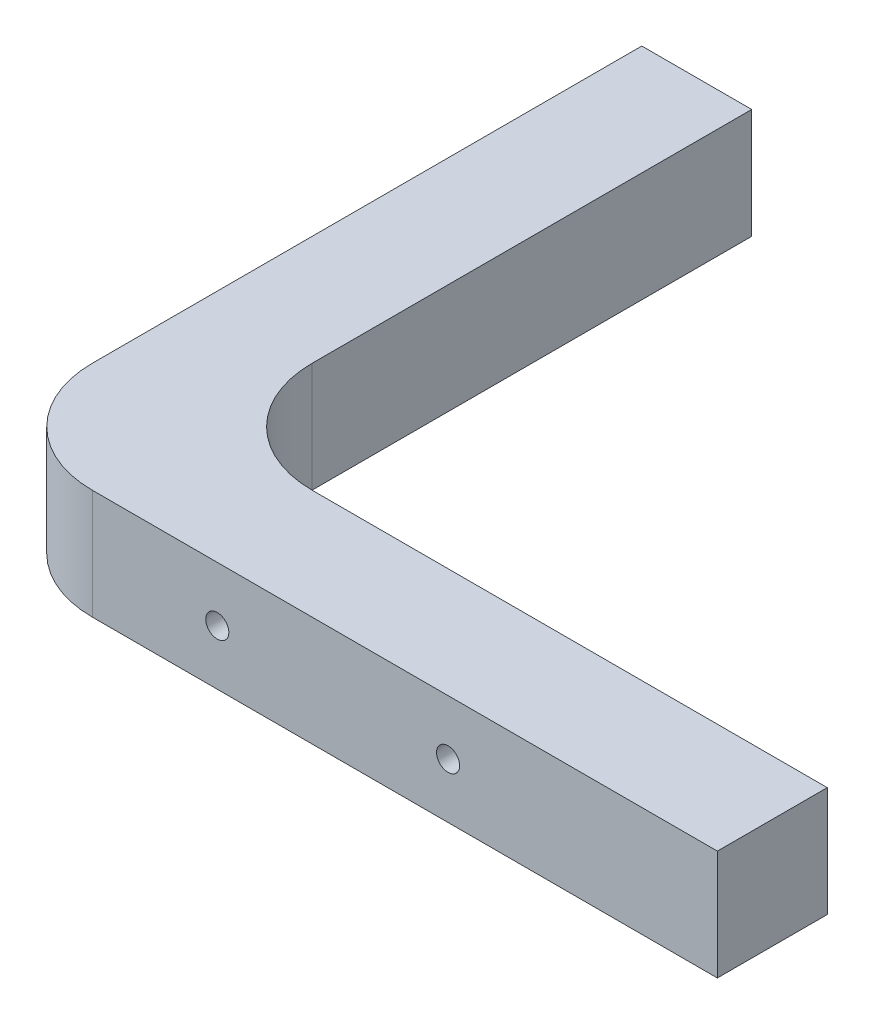
ISO-10303-21;
HEADER;
FILE_DESCRIPTION(('STEP AP214'),'2;1');
FILE_NAME('part.step','',(''),(''),'','','');
FILE_SCHEMA(('AUTOMOTIVE_DESIGN { 1 0 10303 214 1 1 1 1 }'));
ENDSEC;
DATA;
#1=APPLICATION_CONTEXT('core data for automotive mechanical design processes');
#2=APPLICATION_PROTOCOL_DEFINITION('international standard','automotive_design',2000,#1);
#3=PRODUCT_CONTEXT('',#1,'mechanical');
#4=PRODUCT('Part','Part','',(#3));
#5=PRODUCT_RELATED_PRODUCT_CATEGORY('part','',(#4));
#6=PRODUCT_DEFINITION_FORMATION('','',#4);
#7=PRODUCT_DEFINITION_CONTEXT('part definition',#1,'design');
#8=PRODUCT_DEFINITION('design','',#6,#7);
#9=PRODUCT_DEFINITION_SHAPE('','',#8);
#10=(LENGTH_UNIT() NAMED_UNIT(*) SI_UNIT(.MILLI.,.METRE.));
#11=(NAMED_UNIT(*) PLANE_ANGLE_UNIT() SI_UNIT($,.RADIAN.));
#12=(NAMED_UNIT(*) SI_UNIT($,.STERADIAN.) SOLID_ANGLE_UNIT());
#13=UNCERTAINTY_MEASURE_WITH_UNIT(LENGTH_MEASURE(1.E-05),#10,'distance_accuracy_value','');
#14=(GEOMETRIC_REPRESENTATION_CONTEXT(3) GLOBAL_UNCERTAINTY_ASSIGNED_CONTEXT((#13)) GLOBAL_UNIT_ASSIGNED_CONTEXT((#10,
#11,#12)) REPRESENTATION_CONTEXT('',''));
#15=CARTESIAN_POINT('',(0.,0.,0.));
#16=DIRECTION('',(0.,0.,1.));
#17=DIRECTION('',(1.,0.,0.));
#18=AXIS2_PLACEMENT_3D('',#15,#16,#17);
#19=CARTESIAN_POINT('',(0.,20.,-10.));
#20=DIRECTION('',(-1.,0.,0.));
#21=DIRECTION('',(0.,0.,1.));
#22=AXIS2_PLACEMENT_3D('',#19,#20,#21);
#23=PLANE('',#22);
#24=DIRECTION('',(0.,0.,-1.));
#25=VECTOR('',#24,1.);
#26=CARTESIAN_POINT('',(0.,0.,-10.));
#27=LINE('',#26,#25);
#28=CARTESIAN_POINT('',(0.,0.,10.));
#29=VERTEX_POINT('',#28);
#30=CARTESIAN_POINT('',(0.,0.,-10.));
#31=VERTEX_POINT('',#30);
#32=EDGE_CURVE('E127',#29,#31,#27,.T.);
#33=ORIENTED_EDGE('',*,*,#32,.T.);
#34=DIRECTION('',(0.,-1.,0.));
#35=VECTOR('',#34,1.);
#36=CARTESIAN_POINT('',(0.,20.,-10.));
#37=LINE('',#36,#35);
#38=CARTESIAN_POINT('',(0.,20.,-10.));
#39=VERTEX_POINT('',#38);
#40=EDGE_CURVE('E111',#39,#31,#37,.T.);
#41=ORIENTED_EDGE('',*,*,#40,.F.);
#42=DIRECTION('',(0.,0.,-1.));
#43=VECTOR('',#42,1.);
#44=CARTESIAN_POINT('',(0.,20.,-10.));
#45=LINE('',#44,#43);
#46=CARTESIAN_POINT('',(0.,20.,10.));
#47=VERTEX_POINT('',#46);
#48=EDGE_CURVE('E114',#47,#39,#45,.T.);
#49=ORIENTED_EDGE('',*,*,#48,.F.);
#50=DIRECTION('',(0.,-1.,0.));
#51=VECTOR('',#50,1.);
#52=CARTESIAN_POINT('',(0.,20.,10.));
#53=LINE('',#52,#51);
#54=EDGE_CURVE('E168',#47,#29,#53,.T.);
#55=ORIENTED_EDGE('',*,*,#54,.T.);
#56=EDGE_LOOP('',(#33,#41,#49,#55));
#57=FACE_BOUND('',#56,.T.);
#58=ADVANCED_FACE('F45',(#57),#23,.F.);
#59=CARTESIAN_POINT('',(-113.75,20.,-9.99999999999997));
#60=DIRECTION('',(0.,0.,1.));
#61=DIRECTION('',(1.,0.,0.));
#62=AXIS2_PLACEMENT_3D('',#59,#60,#61);
#63=PLANE('',#62);
#64=CARTESIAN_POINT('',(-49.,10.,-9.99999999999999));
#65=DIRECTION('',(0.,0.,-1.));
#66=DIRECTION('',(-1.,0.,0.));
#67=AXIS2_PLACEMENT_3D('',#64,#65,#66);
#68=CIRCLE('',#67,2.1);
#69=CARTESIAN_POINT('',(-51.1,10.,-9.99999999999999));
#70=VERTEX_POINT('',#69);
#71=EDGE_CURVE('E235',#70,#70,#68,.T.);
#72=ORIENTED_EDGE('',*,*,#71,.F.);
#73=EDGE_LOOP('',(#72));
#74=FACE_BOUND('',#73,.T.);
#75=CARTESIAN_POINT('',(-91.,10.,-9.99999999999998));
#76=DIRECTION('',(0.,0.,-1.));
#77=DIRECTION('',(-1.,0.,0.));
#78=AXIS2_PLACEMENT_3D('',#75,#76,#77);
#79=CIRCLE('',#78,2.1);
#80=CARTESIAN_POINT('',(-93.1,10.,-9.99999999999998));
#81=VERTEX_POINT('',#80);
#82=EDGE_CURVE('E236',#81,#81,#79,.T.);
#83=ORIENTED_EDGE('',*,*,#82,.F.);
#84=EDGE_LOOP('',(#83));
#85=FACE_BOUND('',#84,.T.);
#86=DIRECTION('',(-1.,0.,0.));
#87=VECTOR('',#86,1.);
#88=CARTESIAN_POINT('',(-113.75,0.,-9.99999999999997));
#89=LINE('',#88,#87);
#90=CARTESIAN_POINT('',(-93.7500000000001,0.,-9.99999999999998));
#91=VERTEX_POINT('',#90);
#92=EDGE_CURVE('E151',#31,#91,#89,.T.);
#93=ORIENTED_EDGE('',*,*,#92,.T.);
#94=DIRECTION('',(0.,-1.,0.));
#95=VECTOR('',#94,1.);
#96=CARTESIAN_POINT('',(-93.7500000000001,20.,-9.99999999999998));
#97=LINE('',#96,#95);
#98=CARTESIAN_POINT('',(-93.7500000000001,20.,-9.99999999999998));
#99=VERTEX_POINT('',#98);
#100=EDGE_CURVE('E66',#91,#99,#97,.F.);
#101=ORIENTED_EDGE('',*,*,#100,.T.);
#102=DIRECTION('',(-1.,0.,0.));
#103=VECTOR('',#102,1.);
#104=CARTESIAN_POINT('',(-113.75,20.,-9.99999999999997));
#105=LINE('',#104,#103);
#106=EDGE_CURVE('E107',#39,#99,#105,.T.);
#107=ORIENTED_EDGE('',*,*,#106,.F.);
#108=ORIENTED_EDGE('',*,*,#40,.T.);
#109=EDGE_LOOP('',(#93,#101,#107,#108));
#110=FACE_BOUND('',#109,.T.);
#111=ADVANCED_FACE('F109',(#74,#85,#110),#63,.F.);
#112=CARTESIAN_POINT('',(-113.75,20.,-110.));
#113=DIRECTION('',(-1.,0.,0.));
#114=DIRECTION('',(0.,0.,1.));
#115=AXIS2_PLACEMENT_3D('',#112,#113,#114);
#116=PLANE('',#115);
#117=DIRECTION('',(0.,0.,-1.));
#118=VECTOR('',#117,1.);
#119=CARTESIAN_POINT('',(-113.75,20.,-110.));
#120=LINE('',#119,#118);
#121=CARTESIAN_POINT('',(-113.75,20.,-30.));
#122=VERTEX_POINT('',#121);
#123=CARTESIAN_POINT('',(-113.75,20.,-110.));
#124=VERTEX_POINT('',#123);
#125=EDGE_CURVE('E113',#122,#124,#120,.T.);
#126=ORIENTED_EDGE('',*,*,#125,.F.);
#127=DIRECTION('',(0.,-1.,0.));
#128=VECTOR('',#127,1.);
#129=CARTESIAN_POINT('',(-113.75,0.,-30.));
#130=LINE('',#129,#128);
#131=CARTESIAN_POINT('',(-113.75,0.,-30.));
#132=VERTEX_POINT('',#131);
#133=EDGE_CURVE('E144',#122,#132,#130,.T.);
#134=ORIENTED_EDGE('',*,*,#133,.T.);
#135=DIRECTION('',(0.,0.,-1.));
#136=VECTOR('',#135,1.);
#137=CARTESIAN_POINT('',(-113.75,0.,-110.));
#138=LINE('',#137,#136);
#139=CARTESIAN_POINT('',(-113.75,0.,-110.));
#140=VERTEX_POINT('',#139);
#141=EDGE_CURVE('E153',#132,#140,#138,.T.);
#142=ORIENTED_EDGE('',*,*,#141,.T.);
#143=DIRECTION('',(0.,-1.,0.));
#144=VECTOR('',#143,1.);
#145=CARTESIAN_POINT('',(-113.75,20.,-110.));
#146=LINE('',#145,#144);
#147=EDGE_CURVE('E129',#124,#140,#146,.T.);
#148=ORIENTED_EDGE('',*,*,#147,.F.);
#149=EDGE_LOOP('',(#126,#134,#142,#148));
#150=FACE_BOUND('',#149,.T.);
#151=ADVANCED_FACE('F158',(#150),#116,.F.);
#152=CARTESIAN_POINT('',(-133.75,20.,-110.));
#153=DIRECTION('',(0.,0.,1.));
#154=DIRECTION('',(1.,0.,0.));
#155=AXIS2_PLACEMENT_3D('',#152,#153,#154);
#156=PLANE('',#155);
#157=DIRECTION('',(-1.,0.,0.));
#158=VECTOR('',#157,1.);
#159=CARTESIAN_POINT('',(-133.75,0.,-110.));
#160=LINE('',#159,#158);
#161=CARTESIAN_POINT('',(-133.75,0.,-110.));
#162=VERTEX_POINT('',#161);
#163=EDGE_CURVE('E172',#140,#162,#160,.T.);
#164=ORIENTED_EDGE('',*,*,#163,.T.);
#165=DIRECTION('',(0.,-1.,0.));
#166=VECTOR('',#165,1.);
#167=CARTESIAN_POINT('',(-133.75,20.,-110.));
#168=LINE('',#167,#166);
#169=CARTESIAN_POINT('',(-133.75,20.,-110.));
#170=VERTEX_POINT('',#169);
#171=EDGE_CURVE('E135',#170,#162,#168,.T.);
#172=ORIENTED_EDGE('',*,*,#171,.F.);
#173=DIRECTION('',(-1.,0.,0.));
#174=VECTOR('',#173,1.);
#175=CARTESIAN_POINT('',(-133.75,20.,-110.));
#176=LINE('',#175,#174);
#177=EDGE_CURVE('E161',#124,#170,#176,.T.);
#178=ORIENTED_EDGE('',*,*,#177,.F.);
#179=ORIENTED_EDGE('',*,*,#147,.T.);
#180=EDGE_LOOP('',(#164,#172,#178,#179));
#181=FACE_BOUND('',#180,.T.);
#182=ADVANCED_FACE('F202',(#181),#156,.F.);
#183=CARTESIAN_POINT('',(-133.75,20.,9.99999999999997));
#184=DIRECTION('',(1.,0.,0.));
#185=DIRECTION('',(0.,0.,-1.));
#186=AXIS2_PLACEMENT_3D('',#183,#184,#185);
#187=PLANE('',#186);
#188=DIRECTION('',(0.,0.,1.));
#189=VECTOR('',#188,1.);
#190=CARTESIAN_POINT('',(-133.75,0.,9.99999999999997));
#191=LINE('',#190,#189);
#192=CARTESIAN_POINT('',(-133.75,0.,-10.));
#193=VERTEX_POINT('',#192);
#194=EDGE_CURVE('E174',#162,#193,#191,.T.);
#195=ORIENTED_EDGE('',*,*,#194,.T.);
#196=DIRECTION('',(0.,-1.,0.));
#197=VECTOR('',#196,1.);
#198=CARTESIAN_POINT('',(-133.75,20.,-10.));
#199=LINE('',#198,#197);
#200=CARTESIAN_POINT('',(-133.75,20.,-10.));
#201=VERTEX_POINT('',#200);
#202=EDGE_CURVE('E140',#193,#201,#199,.F.);
#203=ORIENTED_EDGE('',*,*,#202,.T.);
#204=DIRECTION('',(0.,0.,1.));
#205=VECTOR('',#204,1.);
#206=CARTESIAN_POINT('',(-133.75,20.,9.99999999999997));
#207=LINE('',#206,#205);
#208=EDGE_CURVE('E163',#170,#201,#207,.T.);
#209=ORIENTED_EDGE('',*,*,#208,.F.);
#210=ORIENTED_EDGE('',*,*,#171,.T.);
#211=EDGE_LOOP('',(#195,#203,#209,#210));
#212=FACE_BOUND('',#211,.T.);
#213=ADVANCED_FACE('F183',(#212),#187,.F.);
#214=CARTESIAN_POINT('',(0.,20.,10.));
#215=DIRECTION('',(0.,0.,-1.));
#216=DIRECTION('',(-1.,0.,0.));
#217=AXIS2_PLACEMENT_3D('',#214,#215,#216);
#218=PLANE('',#217);
#219=CARTESIAN_POINT('',(-49.,10.,9.99999999999999));
#220=DIRECTION('',(0.,0.,-1.));
#221=DIRECTION('',(-1.,0.,0.));
#222=AXIS2_PLACEMENT_3D('',#219,#220,#221);
#223=CIRCLE('',#222,2.1);
#224=CARTESIAN_POINT('',(-51.1,10.,9.99999999999999));
#225=VERTEX_POINT('',#224);
#226=EDGE_CURVE('E169',#225,#225,#223,.F.);
#227=ORIENTED_EDGE('',*,*,#226,.F.);
#228=EDGE_LOOP('',(#227));
#229=FACE_BOUND('',#228,.T.);
#230=CARTESIAN_POINT('',(-91.,10.,9.99999999999998));
#231=DIRECTION('',(0.,0.,-1.));
#232=DIRECTION('',(-1.,0.,0.));
#233=AXIS2_PLACEMENT_3D('',#230,#231,#232);
#234=CIRCLE('',#233,2.1);
#235=CARTESIAN_POINT('',(-93.1,10.,9.99999999999998));
#236=VERTEX_POINT('',#235);
#237=EDGE_CURVE('E240',#236,#236,#234,.F.);
#238=ORIENTED_EDGE('',*,*,#237,.F.);
#239=EDGE_LOOP('',(#238));
#240=FACE_BOUND('',#239,.T.);
#241=DIRECTION('',(1.,0.,0.));
#242=VECTOR('',#241,1.);
#243=CARTESIAN_POINT('',(0.,20.,10.));
#244=LINE('',#243,#242);
#245=CARTESIAN_POINT('',(-113.75,20.,9.99999999999998));
#246=VERTEX_POINT('',#245);
#247=EDGE_CURVE('E120',#246,#47,#244,.T.);
#248=ORIENTED_EDGE('',*,*,#247,.F.);
#249=DIRECTION('',(0.,-1.,0.));
#250=VECTOR('',#249,1.);
#251=CARTESIAN_POINT('',(-113.75,20.,9.99999999999998));
#252=LINE('',#251,#250);
#253=CARTESIAN_POINT('',(-113.75,0.,9.99999999999998));
#254=VERTEX_POINT('',#253);
#255=EDGE_CURVE('E128',#246,#254,#252,.T.);
#256=ORIENTED_EDGE('',*,*,#255,.T.);
#257=DIRECTION('',(1.,0.,0.));
#258=VECTOR('',#257,1.);
#259=CARTESIAN_POINT('',(0.,0.,10.));
#260=LINE('',#259,#258);
#261=EDGE_CURVE('E124',#254,#29,#260,.T.);
#262=ORIENTED_EDGE('',*,*,#261,.T.);
#263=ORIENTED_EDGE('',*,*,#54,.F.);
#264=EDGE_LOOP('',(#248,#256,#262,#263));
#265=FACE_BOUND('',#264,.T.);
#266=ADVANCED_FACE('F191',(#229,#240,#265),#218,.F.);
#267=CARTESIAN_POINT('',(0.,20.,0.));
#268=DIRECTION('',(0.,-1.,0.));
#269=DIRECTION('',(0.,0.,-1.));
#270=AXIS2_PLACEMENT_3D('',#267,#268,#269);
#271=PLANE('',#270);
#272=ORIENTED_EDGE('',*,*,#208,.T.);
#273=CARTESIAN_POINT('',(-113.75,20.,-10.));
#274=DIRECTION('',(0.,-1.,0.));
#275=DIRECTION('',(0.,0.,-1.));
#276=AXIS2_PLACEMENT_3D('',#273,#274,#275);
#277=CIRCLE('',#276,20.);
#278=EDGE_CURVE('E142',#201,#246,#277,.F.);
#279=ORIENTED_EDGE('',*,*,#278,.T.);
#280=ORIENTED_EDGE('',*,*,#247,.T.);
#281=ORIENTED_EDGE('',*,*,#48,.T.);
#282=ORIENTED_EDGE('',*,*,#106,.T.);
#283=CARTESIAN_POINT('',(-93.7500000000001,20.,-30.));
#284=DIRECTION('',(0.,-1.,0.));
#285=DIRECTION('',(0.,0.,-1.));
#286=AXIS2_PLACEMENT_3D('',#283,#284,#285);
#287=CIRCLE('',#286,20.);
#288=EDGE_CURVE('E11',#99,#122,#287,.T.);
#289=ORIENTED_EDGE('',*,*,#288,.T.);
#290=ORIENTED_EDGE('',*,*,#125,.T.);
#291=ORIENTED_EDGE('',*,*,#177,.T.);
#292=EDGE_LOOP('',(#272,#279,#280,#281,#282,#289,#290,#291));
#293=FACE_BOUND('',#292,.T.);
#294=ADVANCED_FACE('F118',(#293),#271,.F.);
#295=CARTESIAN_POINT('',(0.,0.,0.));
#296=DIRECTION('',(0.,-1.,0.));
#297=DIRECTION('',(0.,0.,-1.));
#298=AXIS2_PLACEMENT_3D('',#295,#296,#297);
#299=PLANE('',#298);
#300=ORIENTED_EDGE('',*,*,#261,.F.);
#301=CARTESIAN_POINT('',(-113.75,0.,-10.));
#302=DIRECTION('',(0.,-1.,0.));
#303=DIRECTION('',(0.,0.,-1.));
#304=AXIS2_PLACEMENT_3D('',#301,#302,#303);
#305=CIRCLE('',#304,20.);
#306=EDGE_CURVE('E132',#254,#193,#305,.T.);
#307=ORIENTED_EDGE('',*,*,#306,.T.);
#308=ORIENTED_EDGE('',*,*,#194,.F.);
#309=ORIENTED_EDGE('',*,*,#163,.F.);
#310=ORIENTED_EDGE('',*,*,#141,.F.);
#311=CARTESIAN_POINT('',(-93.7500000000001,0.,-30.));
#312=DIRECTION('',(0.,-1.,0.));
#313=DIRECTION('',(0.,0.,-1.));
#314=AXIS2_PLACEMENT_3D('',#311,#312,#313);
#315=CIRCLE('',#314,20.);
#316=EDGE_CURVE('E53',#132,#91,#315,.F.);
#317=ORIENTED_EDGE('',*,*,#316,.T.);
#318=ORIENTED_EDGE('',*,*,#92,.F.);
#319=ORIENTED_EDGE('',*,*,#32,.F.);
#320=EDGE_LOOP('',(#300,#307,#308,#309,#310,#317,#318,#319));
#321=FACE_BOUND('',#320,.T.);
#322=ADVANCED_FACE('F150',(#321),#299,.T.);
#323=CARTESIAN_POINT('',(-113.75,20.,-10.));
#324=DIRECTION('',(0.,-1.,0.));
#325=DIRECTION('',(0.,0.,-1.));
#326=AXIS2_PLACEMENT_3D('',#323,#324,#325);
#327=CYLINDRICAL_SURFACE('',#326,20.);
#328=ORIENTED_EDGE('',*,*,#278,.F.);
#329=ORIENTED_EDGE('',*,*,#202,.F.);
#330=ORIENTED_EDGE('',*,*,#306,.F.);
#331=ORIENTED_EDGE('',*,*,#255,.F.);
#332=EDGE_LOOP('',(#328,#329,#330,#331));
#333=FACE_BOUND('',#332,.T.);
#334=ADVANCED_FACE('F189',(#333),#327,.T.);
#335=CARTESIAN_POINT('',(-93.7500000000001,20.,-30.));
#336=DIRECTION('',(0.,1.,0.));
#337=DIRECTION('',(0.,0.,1.));
#338=AXIS2_PLACEMENT_3D('',#335,#336,#337);
#339=CYLINDRICAL_SURFACE('',#338,20.);
#340=ORIENTED_EDGE('',*,*,#288,.F.);
#341=ORIENTED_EDGE('',*,*,#100,.F.);
#342=ORIENTED_EDGE('',*,*,#316,.F.);
#343=ORIENTED_EDGE('',*,*,#133,.F.);
#344=EDGE_LOOP('',(#340,#341,#342,#343));
#345=FACE_BOUND('',#344,.T.);
#346=ADVANCED_FACE('F47',(#345),#339,.F.);
#347=CARTESIAN_POINT('',(-91.,10.,15.939696961967));
#348=DIRECTION('',(0.,0.,-1.));
#349=DIRECTION('',(-1.,0.,0.));
#350=AXIS2_PLACEMENT_3D('',#347,#348,#349);
#351=CYLINDRICAL_SURFACE('',#350,2.1);
#352=ORIENTED_EDGE('',*,*,#237,.T.);
#353=EDGE_LOOP('',(#352));
#354=FACE_BOUND('',#353,.T.);
#355=ORIENTED_EDGE('',*,*,#82,.T.);
#356=EDGE_LOOP('',(#355));
#357=FACE_BOUND('',#356,.T.);
#358=ADVANCED_FACE('F220',(#354,#357),#351,.F.);
#359=CARTESIAN_POINT('',(-49.,10.,15.939696961967));
#360=DIRECTION('',(0.,0.,-1.));
#361=DIRECTION('',(-1.,0.,0.));
#362=AXIS2_PLACEMENT_3D('',#359,#360,#361);
#363=CYLINDRICAL_SURFACE('',#362,2.1);
#364=ORIENTED_EDGE('',*,*,#226,.T.);
#365=EDGE_LOOP('',(#364));
#366=FACE_BOUND('',#365,.T.);
#367=ORIENTED_EDGE('',*,*,#71,.T.);
#368=EDGE_LOOP('',(#367));
#369=FACE_BOUND('',#368,.T.);
#370=ADVANCED_FACE('F225',(#366,#369),#363,.F.);
#371=CLOSED_SHELL('',(#58,#111,#151,#182,#213,#266,#294,#322,#334,#346,#358,#370));
#372=MANIFOLD_SOLID_BREP('B2',#371);
#373=ADVANCED_BREP_SHAPE_REPRESENTATION('',(#18,#372),#14);
#374=SHAPE_DEFINITION_REPRESENTATION(#9,#373);
ENDSEC;
END-ISO-10303-21;
